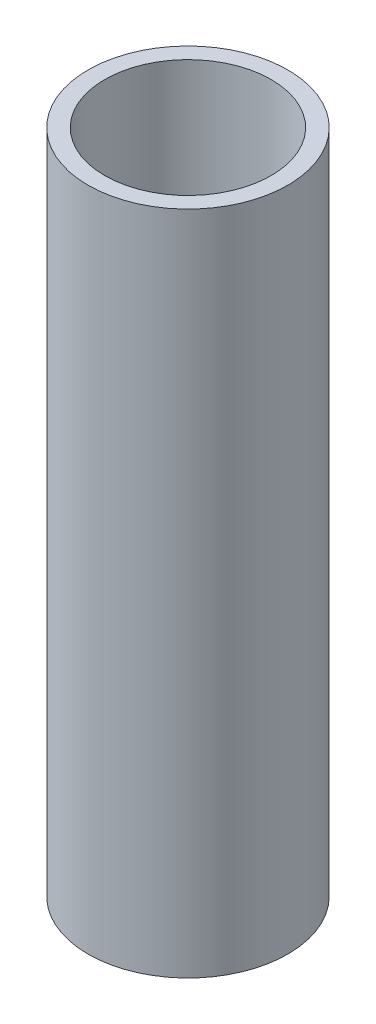
ISO-10303-21;
HEADER;
FILE_DESCRIPTION(('STEP AP214'),'2;1');
FILE_NAME('part.step','',(''),(''),'','','');
FILE_SCHEMA(('AUTOMOTIVE_DESIGN { 1 0 10303 214 1 1 1 1 }'));
ENDSEC;
DATA;
#1=APPLICATION_CONTEXT('core data for automotive mechanical design processes');
#2=APPLICATION_PROTOCOL_DEFINITION('international standard','automotive_design',2000,#1);
#3=PRODUCT_CONTEXT('',#1,'mechanical');
#4=PRODUCT('Part','Part','',(#3));
#5=PRODUCT_RELATED_PRODUCT_CATEGORY('part','',(#4));
#6=PRODUCT_DEFINITION_FORMATION('','',#4);
#7=PRODUCT_DEFINITION_CONTEXT('part definition',#1,'design');
#8=PRODUCT_DEFINITION('design','',#6,#7);
#9=PRODUCT_DEFINITION_SHAPE('','',#8);
#10=(LENGTH_UNIT() NAMED_UNIT(*) SI_UNIT(.MILLI.,.METRE.));
#11=(NAMED_UNIT(*) PLANE_ANGLE_UNIT() SI_UNIT($,.RADIAN.));
#12=(NAMED_UNIT(*) SI_UNIT($,.STERADIAN.) SOLID_ANGLE_UNIT());
#13=UNCERTAINTY_MEASURE_WITH_UNIT(LENGTH_MEASURE(1.E-05),#10,'distance_accuracy_value','');
#14=(GEOMETRIC_REPRESENTATION_CONTEXT(3) GLOBAL_UNCERTAINTY_ASSIGNED_CONTEXT((#13)) GLOBAL_UNIT_ASSIGNED_CONTEXT((#10,
#11,#12)) REPRESENTATION_CONTEXT('',''));
#15=CARTESIAN_POINT('',(0.,0.,0.));
#16=DIRECTION('',(0.,0.,1.));
#17=DIRECTION('',(1.,0.,0.));
#18=AXIS2_PLACEMENT_3D('',#15,#16,#17);
#19=CARTESIAN_POINT('',(0.,100.,0.));
#20=DIRECTION('',(0.,1.,0.));
#21=DIRECTION('',(0.,0.,1.));
#22=AXIS2_PLACEMENT_3D('',#19,#20,#21);
#23=PLANE('',#22);
#24=CARTESIAN_POINT('',(0.,100.,0.));
#25=DIRECTION('',(0.,1.,0.));
#26=DIRECTION('',(0.,0.,1.));
#27=AXIS2_PLACEMENT_3D('',#24,#25,#26);
#28=CIRCLE('',#27,15.);
#29=CARTESIAN_POINT('',(0.,100.,15.));
#30=VERTEX_POINT('',#29);
#31=EDGE_CURVE('E10',#30,#30,#28,.T.);
#32=ORIENTED_EDGE('',*,*,#31,.T.);
#33=EDGE_LOOP('',(#32));
#34=FACE_BOUND('',#33,.T.);
#35=CARTESIAN_POINT('',(0.,100.,0.));
#36=DIRECTION('',(0.,1.,0.));
#37=DIRECTION('',(0.,0.,1.));
#38=AXIS2_PLACEMENT_3D('',#35,#36,#37);
#39=CIRCLE('',#38,12.5);
#40=CARTESIAN_POINT('',(0.,100.,12.5));
#41=VERTEX_POINT('',#40);
#42=EDGE_CURVE('E42',#41,#41,#39,.T.);
#43=ORIENTED_EDGE('',*,*,#42,.F.);
#44=EDGE_LOOP('',(#43));
#45=FACE_BOUND('',#44,.T.);
#46=ADVANCED_FACE('F31',(#34,#45),#23,.T.);
#47=CARTESIAN_POINT('',(0.,0.,0.));
#48=DIRECTION('',(0.,1.,0.));
#49=DIRECTION('',(0.,0.,1.));
#50=AXIS2_PLACEMENT_3D('',#47,#48,#49);
#51=PLANE('',#50);
#52=CARTESIAN_POINT('',(0.,0.,0.));
#53=DIRECTION('',(0.,1.,0.));
#54=DIRECTION('',(0.,0.,1.));
#55=AXIS2_PLACEMENT_3D('',#52,#53,#54);
#56=CIRCLE('',#55,15.);
#57=CARTESIAN_POINT('',(0.,0.,15.));
#58=VERTEX_POINT('',#57);
#59=EDGE_CURVE('E35',#58,#58,#56,.T.);
#60=ORIENTED_EDGE('',*,*,#59,.F.);
#61=EDGE_LOOP('',(#60));
#62=FACE_BOUND('',#61,.T.);
#63=CARTESIAN_POINT('',(0.,0.,0.));
#64=DIRECTION('',(0.,1.,0.));
#65=DIRECTION('',(0.,0.,1.));
#66=AXIS2_PLACEMENT_3D('',#63,#64,#65);
#67=CIRCLE('',#66,12.5);
#68=CARTESIAN_POINT('',(0.,0.,12.5));
#69=VERTEX_POINT('',#68);
#70=EDGE_CURVE('E44',#69,#69,#67,.T.);
#71=ORIENTED_EDGE('',*,*,#70,.T.);
#72=EDGE_LOOP('',(#71));
#73=FACE_BOUND('',#72,.T.);
#74=ADVANCED_FACE('F54',(#62,#73),#51,.F.);
#75=CARTESIAN_POINT('',(0.,100.,0.));
#76=DIRECTION('',(0.,-1.,0.));
#77=DIRECTION('',(0.,0.,-1.));
#78=AXIS2_PLACEMENT_3D('',#75,#76,#77);
#79=CYLINDRICAL_SURFACE('',#78,15.);
#80=ORIENTED_EDGE('',*,*,#31,.F.);
#81=EDGE_LOOP('',(#80));
#82=FACE_BOUND('',#81,.T.);
#83=ORIENTED_EDGE('',*,*,#59,.T.);
#84=EDGE_LOOP('',(#83));
#85=FACE_BOUND('',#84,.T.);
#86=ADVANCED_FACE('F33',(#82,#85),#79,.T.);
#87=CARTESIAN_POINT('',(0.,100.,0.));
#88=DIRECTION('',(0.,-1.,0.));
#89=DIRECTION('',(0.,0.,-1.));
#90=AXIS2_PLACEMENT_3D('',#87,#88,#89);
#91=CYLINDRICAL_SURFACE('',#90,12.5);
#92=ORIENTED_EDGE('',*,*,#42,.T.);
#93=EDGE_LOOP('',(#92));
#94=FACE_BOUND('',#93,.T.);
#95=ORIENTED_EDGE('',*,*,#70,.F.);
#96=EDGE_LOOP('',(#95));
#97=FACE_BOUND('',#96,.T.);
#98=ADVANCED_FACE('F50',(#94,#97),#91,.F.);
#99=CLOSED_SHELL('',(#46,#74,#86,#98));
#100=MANIFOLD_SOLID_BREP('B2',#99);
#101=ADVANCED_BREP_SHAPE_REPRESENTATION('',(#18,#100),#14);
#102=SHAPE_DEFINITION_REPRESENTATION(#9,#101);
ENDSEC;
END-ISO-10303-21;
